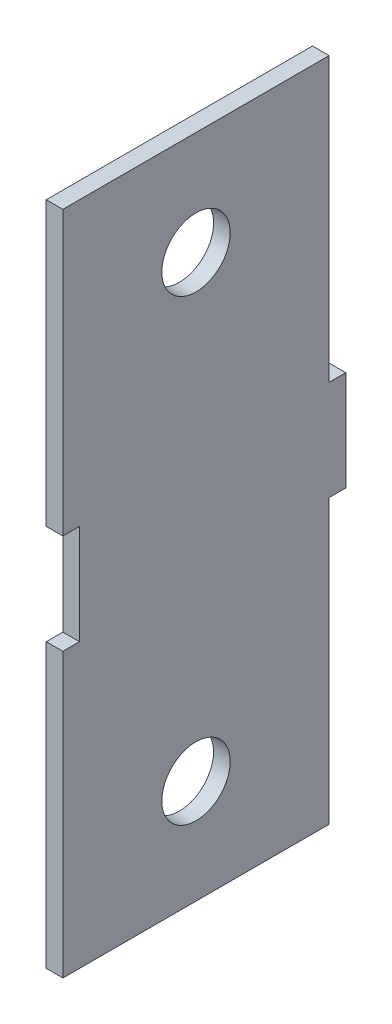
ISO-10303-21;
HEADER;
FILE_DESCRIPTION(('STEP AP214'),'2;1');
FILE_NAME('part.step','',(''),(''),'','','');
FILE_SCHEMA(('AUTOMOTIVE_DESIGN { 1 0 10303 214 1 1 1 1 }'));
ENDSEC;
DATA;
#1=APPLICATION_CONTEXT('core data for automotive mechanical design processes');
#2=APPLICATION_PROTOCOL_DEFINITION('international standard','automotive_design',2000,#1);
#3=PRODUCT_CONTEXT('',#1,'mechanical');
#4=PRODUCT('Part','Part','',(#3));
#5=PRODUCT_RELATED_PRODUCT_CATEGORY('part','',(#4));
#6=PRODUCT_DEFINITION_FORMATION('','',#4);
#7=PRODUCT_DEFINITION_CONTEXT('part definition',#1,'design');
#8=PRODUCT_DEFINITION('design','',#6,#7);
#9=PRODUCT_DEFINITION_SHAPE('','',#8);
#10=(LENGTH_UNIT() NAMED_UNIT(*) SI_UNIT(.MILLI.,.METRE.));
#11=(NAMED_UNIT(*) PLANE_ANGLE_UNIT() SI_UNIT($,.RADIAN.));
#12=(NAMED_UNIT(*) SI_UNIT($,.STERADIAN.) SOLID_ANGLE_UNIT());
#13=UNCERTAINTY_MEASURE_WITH_UNIT(LENGTH_MEASURE(1.E-05),#10,'distance_accuracy_value','');
#14=(GEOMETRIC_REPRESENTATION_CONTEXT(3) GLOBAL_UNCERTAINTY_ASSIGNED_CONTEXT((#13)) GLOBAL_UNIT_ASSIGNED_CONTEXT((#10,
#11,#12)) REPRESENTATION_CONTEXT('',''));
#15=CARTESIAN_POINT('',(0.,0.,0.));
#16=DIRECTION('',(0.,0.,1.));
#17=DIRECTION('',(1.,0.,0.));
#18=AXIS2_PLACEMENT_3D('',#15,#16,#17);
#19=CARTESIAN_POINT('',(1.5875,0.,0.));
#20=DIRECTION('',(-1.,0.,0.));
#21=DIRECTION('',(0.,0.,1.));
#22=AXIS2_PLACEMENT_3D('',#19,#20,#21);
#23=PLANE('',#22);
#24=CARTESIAN_POINT('',(1.5875,-21.844,0.));
#25=DIRECTION('',(1.,0.,0.));
#26=DIRECTION('',(0.,0.,-1.));
#27=AXIS2_PLACEMENT_3D('',#24,#25,#26);
#28=CIRCLE('',#27,3.2639);
#29=CARTESIAN_POINT('',(1.5875,-21.844,-3.26389999999992));
#30=VERTEX_POINT('',#29);
#31=EDGE_CURVE('E203',#30,#30,#28,.T.);
#32=ORIENTED_EDGE('',*,*,#31,.F.);
#33=EDGE_LOOP('',(#32));
#34=FACE_BOUND('',#33,.T.);
#35=CARTESIAN_POINT('',(1.5875,21.844,0.));
#36=DIRECTION('',(1.,0.,0.));
#37=DIRECTION('',(0.,0.,-1.));
#38=AXIS2_PLACEMENT_3D('',#35,#36,#37);
#39=CIRCLE('',#38,3.2639);
#40=CARTESIAN_POINT('',(1.5875,21.844,-3.26390000000007));
#41=VERTEX_POINT('',#40);
#42=EDGE_CURVE('E211',#41,#41,#39,.T.);
#43=ORIENTED_EDGE('',*,*,#42,.F.);
#44=EDGE_LOOP('',(#43));
#45=FACE_BOUND('',#44,.T.);
#46=DIRECTION('',(0.,0.,-1.));
#47=VECTOR('',#46,1.);
#48=CARTESIAN_POINT('',(1.5875,4.7625,12.7));
#49=LINE('',#48,#47);
#50=CARTESIAN_POINT('',(1.5875,4.7625,12.7));
#51=VERTEX_POINT('',#50);
#52=CARTESIAN_POINT('',(1.5875,4.7625,11.1125));
#53=VERTEX_POINT('',#52);
#54=EDGE_CURVE('E139',#51,#53,#49,.T.);
#55=ORIENTED_EDGE('',*,*,#54,.T.);
#56=DIRECTION('',(0.,-1.,0.));
#57=VECTOR('',#56,1.);
#58=CARTESIAN_POINT('',(1.5875,4.7625,11.1125));
#59=LINE('',#58,#57);
#60=CARTESIAN_POINT('',(1.5875,-4.7625,11.1125));
#61=VERTEX_POINT('',#60);
#62=EDGE_CURVE('E148',#53,#61,#59,.T.);
#63=ORIENTED_EDGE('',*,*,#62,.T.);
#64=DIRECTION('',(0.,0.,-1.));
#65=VECTOR('',#64,1.);
#66=CARTESIAN_POINT('',(1.5875,-4.7625,12.7));
#67=LINE('',#66,#65);
#68=CARTESIAN_POINT('',(1.5875,-4.7625,12.7));
#69=VERTEX_POINT('',#68);
#70=EDGE_CURVE('E154',#69,#61,#67,.T.);
#71=ORIENTED_EDGE('',*,*,#70,.F.);
#72=DIRECTION('',(0.,-1.,0.));
#73=VECTOR('',#72,1.);
#74=CARTESIAN_POINT('',(1.5875,-31.75,12.7));
#75=LINE('',#74,#73);
#76=CARTESIAN_POINT('',(1.5875,-31.75,12.7));
#77=VERTEX_POINT('',#76);
#78=EDGE_CURVE('E227',#69,#77,#75,.T.);
#79=ORIENTED_EDGE('',*,*,#78,.T.);
#80=DIRECTION('',(0.,0.,-1.));
#81=VECTOR('',#80,1.);
#82=CARTESIAN_POINT('',(1.5875,-31.75,12.7));
#83=LINE('',#82,#81);
#84=CARTESIAN_POINT('',(1.5875,-31.75,-12.7));
#85=VERTEX_POINT('',#84);
#86=EDGE_CURVE('E230',#77,#85,#83,.T.);
#87=ORIENTED_EDGE('',*,*,#86,.T.);
#88=DIRECTION('',(0.,1.,0.));
#89=VECTOR('',#88,1.);
#90=CARTESIAN_POINT('',(1.5875,-31.75,-12.7));
#91=LINE('',#90,#89);
#92=CARTESIAN_POINT('',(1.5875,-4.7625,-12.7));
#93=VERTEX_POINT('',#92);
#94=EDGE_CURVE('E219',#85,#93,#91,.T.);
#95=ORIENTED_EDGE('',*,*,#94,.T.);
#96=DIRECTION('',(0.,0.,-1.));
#97=VECTOR('',#96,1.);
#98=CARTESIAN_POINT('',(1.5875,-4.7625,-12.7));
#99=LINE('',#98,#97);
#100=CARTESIAN_POINT('',(1.5875,-4.7625,-14.2875));
#101=VERTEX_POINT('',#100);
#102=EDGE_CURVE('E69',#93,#101,#99,.T.);
#103=ORIENTED_EDGE('',*,*,#102,.T.);
#104=DIRECTION('',(0.,-1.,0.));
#105=VECTOR('',#104,1.);
#106=CARTESIAN_POINT('',(1.5875,4.7625,-14.2875));
#107=LINE('',#106,#105);
#108=CARTESIAN_POINT('',(1.5875,4.7625,-14.2875));
#109=VERTEX_POINT('',#108);
#110=EDGE_CURVE('E184',#109,#101,#107,.T.);
#111=ORIENTED_EDGE('',*,*,#110,.F.);
#112=DIRECTION('',(0.,0.,-1.));
#113=VECTOR('',#112,1.);
#114=CARTESIAN_POINT('',(1.5875,4.7625,-12.7));
#115=LINE('',#114,#113);
#116=CARTESIAN_POINT('',(1.5875,4.7625,-12.7));
#117=VERTEX_POINT('',#116);
#118=EDGE_CURVE('E175',#117,#109,#115,.T.);
#119=ORIENTED_EDGE('',*,*,#118,.F.);
#120=CARTESIAN_POINT('',(1.5875,31.75,-12.7));
#121=VERTEX_POINT('',#120);
#122=EDGE_CURVE('E224',#117,#121,#91,.T.);
#123=ORIENTED_EDGE('',*,*,#122,.T.);
#124=DIRECTION('',(0.,0.,1.));
#125=VECTOR('',#124,1.);
#126=CARTESIAN_POINT('',(1.5875,31.75,12.7));
#127=LINE('',#126,#125);
#128=CARTESIAN_POINT('',(1.5875,31.75,12.7));
#129=VERTEX_POINT('',#128);
#130=EDGE_CURVE('E223',#121,#129,#127,.T.);
#131=ORIENTED_EDGE('',*,*,#130,.T.);
#132=EDGE_CURVE('E158',#129,#51,#75,.T.);
#133=ORIENTED_EDGE('',*,*,#132,.T.);
#134=EDGE_LOOP('',(#55,#63,#71,#79,#87,#95,#103,#111,#119,#123,#131,#133));
#135=FACE_BOUND('',#134,.T.);
#136=ADVANCED_FACE('F45',(#34,#45,#135),#23,.F.);
#137=CARTESIAN_POINT('',(0.,0.,0.));
#138=DIRECTION('',(-1.,0.,0.));
#139=DIRECTION('',(0.,0.,1.));
#140=AXIS2_PLACEMENT_3D('',#137,#138,#139);
#141=PLANE('',#140);
#142=CARTESIAN_POINT('',(0.,21.844,0.));
#143=DIRECTION('',(1.,0.,0.));
#144=DIRECTION('',(0.,0.,-1.));
#145=AXIS2_PLACEMENT_3D('',#142,#143,#144);
#146=CIRCLE('',#145,3.2639);
#147=CARTESIAN_POINT('',(0.,21.844,-3.26390000000007));
#148=VERTEX_POINT('',#147);
#149=EDGE_CURVE('E207',#148,#148,#146,.T.);
#150=ORIENTED_EDGE('',*,*,#149,.T.);
#151=EDGE_LOOP('',(#150));
#152=FACE_BOUND('',#151,.T.);
#153=CARTESIAN_POINT('',(0.,-21.844,0.));
#154=DIRECTION('',(1.,0.,0.));
#155=DIRECTION('',(0.,0.,-1.));
#156=AXIS2_PLACEMENT_3D('',#153,#154,#155);
#157=CIRCLE('',#156,3.2639);
#158=CARTESIAN_POINT('',(0.,-21.844,-3.26389999999992));
#159=VERTEX_POINT('',#158);
#160=EDGE_CURVE('E193',#159,#159,#157,.T.);
#161=ORIENTED_EDGE('',*,*,#160,.T.);
#162=EDGE_LOOP('',(#161));
#163=FACE_BOUND('',#162,.T.);
#164=DIRECTION('',(0.,1.,0.));
#165=VECTOR('',#164,1.);
#166=CARTESIAN_POINT('',(0.,0.,11.1125));
#167=LINE('',#166,#165);
#168=CARTESIAN_POINT('',(0.,-4.7625,11.1125));
#169=VERTEX_POINT('',#168);
#170=CARTESIAN_POINT('',(0.,4.7625,11.1125));
#171=VERTEX_POINT('',#170);
#172=EDGE_CURVE('E11',#169,#171,#167,.T.);
#173=ORIENTED_EDGE('',*,*,#172,.T.);
#174=DIRECTION('',(0.,0.,1.));
#175=VECTOR('',#174,1.);
#176=CARTESIAN_POINT('',(0.,4.7625,0.));
#177=LINE('',#176,#175);
#178=CARTESIAN_POINT('',(0.,4.7625,12.7));
#179=VERTEX_POINT('',#178);
#180=EDGE_CURVE('E142',#171,#179,#177,.T.);
#181=ORIENTED_EDGE('',*,*,#180,.T.);
#182=DIRECTION('',(0.,-1.,0.));
#183=VECTOR('',#182,1.);
#184=CARTESIAN_POINT('',(0.,-31.75,12.7));
#185=LINE('',#184,#183);
#186=CARTESIAN_POINT('',(0.,31.75,12.7));
#187=VERTEX_POINT('',#186);
#188=EDGE_CURVE('E242',#187,#179,#185,.T.);
#189=ORIENTED_EDGE('',*,*,#188,.F.);
#190=DIRECTION('',(0.,0.,1.));
#191=VECTOR('',#190,1.);
#192=CARTESIAN_POINT('',(0.,31.75,12.7));
#193=LINE('',#192,#191);
#194=CARTESIAN_POINT('',(0.,31.75,-12.7));
#195=VERTEX_POINT('',#194);
#196=EDGE_CURVE('E238',#195,#187,#193,.T.);
#197=ORIENTED_EDGE('',*,*,#196,.F.);
#198=DIRECTION('',(0.,1.,0.));
#199=VECTOR('',#198,1.);
#200=CARTESIAN_POINT('',(0.,-31.75,-12.7));
#201=LINE('',#200,#199);
#202=CARTESIAN_POINT('',(0.,4.7625,-12.7));
#203=VERTEX_POINT('',#202);
#204=EDGE_CURVE('E215',#203,#195,#201,.T.);
#205=ORIENTED_EDGE('',*,*,#204,.F.);
#206=DIRECTION('',(0.,0.,-1.));
#207=VECTOR('',#206,1.);
#208=CARTESIAN_POINT('',(0.,4.7625,-12.7));
#209=LINE('',#208,#207);
#210=CARTESIAN_POINT('',(0.,4.7625,-14.2875));
#211=VERTEX_POINT('',#210);
#212=EDGE_CURVE('E178',#203,#211,#209,.T.);
#213=ORIENTED_EDGE('',*,*,#212,.T.);
#214=DIRECTION('',(0.,-1.,0.));
#215=VECTOR('',#214,1.);
#216=CARTESIAN_POINT('',(0.,4.7625,-14.2875));
#217=LINE('',#216,#215);
#218=CARTESIAN_POINT('',(0.,-4.7625,-14.2875));
#219=VERTEX_POINT('',#218);
#220=EDGE_CURVE('E174',#211,#219,#217,.T.);
#221=ORIENTED_EDGE('',*,*,#220,.T.);
#222=DIRECTION('',(0.,0.,-1.));
#223=VECTOR('',#222,1.);
#224=CARTESIAN_POINT('',(0.,-4.7625,-12.7));
#225=LINE('',#224,#223);
#226=CARTESIAN_POINT('',(0.,-4.7625,-12.7));
#227=VERTEX_POINT('',#226);
#228=EDGE_CURVE('E170',#227,#219,#225,.T.);
#229=ORIENTED_EDGE('',*,*,#228,.F.);
#230=CARTESIAN_POINT('',(0.,-31.75,-12.7));
#231=VERTEX_POINT('',#230);
#232=EDGE_CURVE('E234',#231,#227,#201,.T.);
#233=ORIENTED_EDGE('',*,*,#232,.F.);
#234=DIRECTION('',(0.,0.,-1.));
#235=VECTOR('',#234,1.);
#236=CARTESIAN_POINT('',(0.,-31.75,12.7));
#237=LINE('',#236,#235);
#238=CARTESIAN_POINT('',(0.,-31.75,12.7));
#239=VERTEX_POINT('',#238);
#240=EDGE_CURVE('E246',#239,#231,#237,.T.);
#241=ORIENTED_EDGE('',*,*,#240,.F.);
#242=CARTESIAN_POINT('',(0.,-4.7625,12.7));
#243=VERTEX_POINT('',#242);
#244=EDGE_CURVE('E241',#243,#239,#185,.T.);
#245=ORIENTED_EDGE('',*,*,#244,.F.);
#246=DIRECTION('',(0.,0.,1.));
#247=VECTOR('',#246,1.);
#248=CARTESIAN_POINT('',(0.,-4.76249999999999,0.));
#249=LINE('',#248,#247);
#250=EDGE_CURVE('E61',#169,#243,#249,.T.);
#251=ORIENTED_EDGE('',*,*,#250,.F.);
#252=EDGE_LOOP('',(#173,#181,#189,#197,#205,#213,#221,#229,#233,#241,#245,#251));
#253=FACE_BOUND('',#252,.T.);
#254=ADVANCED_FACE('F270',(#152,#163,#253),#141,.T.);
#255=CARTESIAN_POINT('',(1.5875,-31.75,12.7));
#256=DIRECTION('',(0.,0.,-1.));
#257=DIRECTION('',(-1.,0.,0.));
#258=AXIS2_PLACEMENT_3D('',#255,#256,#257);
#259=PLANE('',#258);
#260=DIRECTION('',(-1.,0.,0.));
#261=VECTOR('',#260,1.);
#262=CARTESIAN_POINT('',(1.5875,4.7625,12.7));
#263=LINE('',#262,#261);
#264=EDGE_CURVE('E54',#51,#179,#263,.T.);
#265=ORIENTED_EDGE('',*,*,#264,.F.);
#266=ORIENTED_EDGE('',*,*,#132,.F.);
#267=DIRECTION('',(-1.,0.,0.));
#268=VECTOR('',#267,1.);
#269=CARTESIAN_POINT('',(1.5875,31.75,12.7));
#270=LINE('',#269,#268);
#271=EDGE_CURVE('E256',#129,#187,#270,.T.);
#272=ORIENTED_EDGE('',*,*,#271,.T.);
#273=ORIENTED_EDGE('',*,*,#188,.T.);
#274=EDGE_LOOP('',(#265,#266,#272,#273));
#275=FACE_BOUND('',#274,.T.);
#276=ADVANCED_FACE('F272',(#275),#259,.F.);
#277=CARTESIAN_POINT('',(1.5875,-31.75,-12.7));
#278=DIRECTION('',(0.,0.,1.));
#279=DIRECTION('',(1.,0.,0.));
#280=AXIS2_PLACEMENT_3D('',#277,#278,#279);
#281=PLANE('',#280);
#282=DIRECTION('',(1.,0.,0.));
#283=VECTOR('',#282,1.);
#284=CARTESIAN_POINT('',(0.,4.7625,-12.7));
#285=LINE('',#284,#283);
#286=EDGE_CURVE('E194',#203,#117,#285,.T.);
#287=ORIENTED_EDGE('',*,*,#286,.F.);
#288=ORIENTED_EDGE('',*,*,#204,.T.);
#289=DIRECTION('',(-1.,0.,0.));
#290=VECTOR('',#289,1.);
#291=CARTESIAN_POINT('',(1.5875,31.75,-12.7));
#292=LINE('',#291,#290);
#293=EDGE_CURVE('E260',#121,#195,#292,.T.);
#294=ORIENTED_EDGE('',*,*,#293,.F.);
#295=ORIENTED_EDGE('',*,*,#122,.F.);
#296=EDGE_LOOP('',(#287,#288,#294,#295));
#297=FACE_BOUND('',#296,.T.);
#298=ADVANCED_FACE('F308',(#297),#281,.F.);
#299=ORIENTED_EDGE('',*,*,#232,.T.);
#300=DIRECTION('',(1.,0.,0.));
#301=VECTOR('',#300,1.);
#302=CARTESIAN_POINT('',(0.,-4.7625,-12.7));
#303=LINE('',#302,#301);
#304=EDGE_CURVE('E190',#227,#93,#303,.T.);
#305=ORIENTED_EDGE('',*,*,#304,.T.);
#306=ORIENTED_EDGE('',*,*,#94,.F.);
#307=DIRECTION('',(-1.,0.,0.));
#308=VECTOR('',#307,1.);
#309=CARTESIAN_POINT('',(1.5875,-31.75,-12.7));
#310=LINE('',#309,#308);
#311=EDGE_CURVE('E233',#85,#231,#310,.T.);
#312=ORIENTED_EDGE('',*,*,#311,.T.);
#313=EDGE_LOOP('',(#299,#305,#306,#312));
#314=FACE_BOUND('',#313,.T.);
#315=ADVANCED_FACE('F47',(#314),#281,.F.);
#316=CARTESIAN_POINT('',(1.5875,31.75,12.7));
#317=DIRECTION('',(0.,-1.,0.));
#318=DIRECTION('',(0.,0.,-1.));
#319=AXIS2_PLACEMENT_3D('',#316,#317,#318);
#320=PLANE('',#319);
#321=ORIENTED_EDGE('',*,*,#196,.T.);
#322=ORIENTED_EDGE('',*,*,#271,.F.);
#323=ORIENTED_EDGE('',*,*,#130,.F.);
#324=ORIENTED_EDGE('',*,*,#293,.T.);
#325=EDGE_LOOP('',(#321,#322,#323,#324));
#326=FACE_BOUND('',#325,.T.);
#327=ADVANCED_FACE('F276',(#326),#320,.F.);
#328=ORIENTED_EDGE('',*,*,#78,.F.);
#329=DIRECTION('',(-1.,0.,0.));
#330=VECTOR('',#329,1.);
#331=CARTESIAN_POINT('',(1.5875,-4.7625,12.7));
#332=LINE('',#331,#330);
#333=EDGE_CURVE('E264',#69,#243,#332,.T.);
#334=ORIENTED_EDGE('',*,*,#333,.T.);
#335=ORIENTED_EDGE('',*,*,#244,.T.);
#336=DIRECTION('',(-1.,0.,0.));
#337=VECTOR('',#336,1.);
#338=CARTESIAN_POINT('',(1.5875,-31.75,12.7));
#339=LINE('',#338,#337);
#340=EDGE_CURVE('E252',#77,#239,#339,.T.);
#341=ORIENTED_EDGE('',*,*,#340,.F.);
#342=EDGE_LOOP('',(#328,#334,#335,#341));
#343=FACE_BOUND('',#342,.T.);
#344=ADVANCED_FACE('F291',(#343),#259,.F.);
#345=CARTESIAN_POINT('',(1.5875,-31.75,12.7));
#346=DIRECTION('',(0.,1.,0.));
#347=DIRECTION('',(0.,0.,1.));
#348=AXIS2_PLACEMENT_3D('',#345,#346,#347);
#349=PLANE('',#348);
#350=ORIENTED_EDGE('',*,*,#240,.T.);
#351=ORIENTED_EDGE('',*,*,#311,.F.);
#352=ORIENTED_EDGE('',*,*,#86,.F.);
#353=ORIENTED_EDGE('',*,*,#340,.T.);
#354=EDGE_LOOP('',(#350,#351,#352,#353));
#355=FACE_BOUND('',#354,.T.);
#356=ADVANCED_FACE('F295',(#355),#349,.F.);
#357=CARTESIAN_POINT('',(1.5875,21.844,0.));
#358=DIRECTION('',(-1.,0.,0.));
#359=DIRECTION('',(0.,0.,1.));
#360=AXIS2_PLACEMENT_3D('',#357,#358,#359);
#361=CYLINDRICAL_SURFACE('',#360,3.2639);
#362=ORIENTED_EDGE('',*,*,#42,.T.);
#363=EDGE_LOOP('',(#362));
#364=FACE_BOUND('',#363,.T.);
#365=ORIENTED_EDGE('',*,*,#149,.F.);
#366=EDGE_LOOP('',(#365));
#367=FACE_BOUND('',#366,.T.);
#368=ADVANCED_FACE('F328',(#364,#367),#361,.F.);
#369=CARTESIAN_POINT('',(1.5875,-21.844,0.));
#370=DIRECTION('',(-1.,0.,0.));
#371=DIRECTION('',(0.,0.,1.));
#372=AXIS2_PLACEMENT_3D('',#369,#370,#371);
#373=CYLINDRICAL_SURFACE('',#372,3.2639);
#374=ORIENTED_EDGE('',*,*,#31,.T.);
#375=EDGE_LOOP('',(#374));
#376=FACE_BOUND('',#375,.T.);
#377=ORIENTED_EDGE('',*,*,#160,.F.);
#378=EDGE_LOOP('',(#377));
#379=FACE_BOUND('',#378,.T.);
#380=ADVANCED_FACE('F349',(#376,#379),#373,.F.);
#381=CARTESIAN_POINT('',(0.,-4.7625,-12.7));
#382=DIRECTION('',(0.,-1.,0.));
#383=DIRECTION('',(0.,0.,-1.));
#384=AXIS2_PLACEMENT_3D('',#381,#382,#383);
#385=PLANE('',#384);
#386=ORIENTED_EDGE('',*,*,#102,.F.);
#387=ORIENTED_EDGE('',*,*,#304,.F.);
#388=ORIENTED_EDGE('',*,*,#228,.T.);
#389=DIRECTION('',(1.,0.,0.));
#390=VECTOR('',#389,1.);
#391=CARTESIAN_POINT('',(0.,-4.7625,-14.2875));
#392=LINE('',#391,#390);
#393=EDGE_CURVE('E181',#219,#101,#392,.T.);
#394=ORIENTED_EDGE('',*,*,#393,.T.);
#395=EDGE_LOOP('',(#386,#387,#388,#394));
#396=FACE_BOUND('',#395,.T.);
#397=ADVANCED_FACE('F356',(#396),#385,.T.);
#398=CARTESIAN_POINT('',(0.,4.7625,-12.7));
#399=DIRECTION('',(0.,-1.,0.));
#400=DIRECTION('',(0.,0.,-1.));
#401=AXIS2_PLACEMENT_3D('',#398,#399,#400);
#402=PLANE('',#401);
#403=ORIENTED_EDGE('',*,*,#118,.T.);
#404=DIRECTION('',(1.,0.,0.));
#405=VECTOR('',#404,1.);
#406=CARTESIAN_POINT('',(0.,4.7625,-14.2875));
#407=LINE('',#406,#405);
#408=EDGE_CURVE('E197',#211,#109,#407,.T.);
#409=ORIENTED_EDGE('',*,*,#408,.F.);
#410=ORIENTED_EDGE('',*,*,#212,.F.);
#411=ORIENTED_EDGE('',*,*,#286,.T.);
#412=EDGE_LOOP('',(#403,#409,#410,#411));
#413=FACE_BOUND('',#412,.T.);
#414=ADVANCED_FACE('F307',(#413),#402,.F.);
#415=CARTESIAN_POINT('',(0.,4.7625,-14.2875));
#416=DIRECTION('',(0.,0.,1.));
#417=DIRECTION('',(1.,0.,0.));
#418=AXIS2_PLACEMENT_3D('',#415,#416,#417);
#419=PLANE('',#418);
#420=ORIENTED_EDGE('',*,*,#110,.T.);
#421=ORIENTED_EDGE('',*,*,#393,.F.);
#422=ORIENTED_EDGE('',*,*,#220,.F.);
#423=ORIENTED_EDGE('',*,*,#408,.T.);
#424=EDGE_LOOP('',(#420,#421,#422,#423));
#425=FACE_BOUND('',#424,.T.);
#426=ADVANCED_FACE('F304',(#425),#419,.F.);
#427=CARTESIAN_POINT('',(-1.5875,4.7625,12.7));
#428=DIRECTION('',(0.,-1.,0.));
#429=DIRECTION('',(0.,0.,-1.));
#430=AXIS2_PLACEMENT_3D('',#427,#428,#429);
#431=PLANE('',#430);
#432=DIRECTION('',(1.,0.,0.));
#433=VECTOR('',#432,1.);
#434=CARTESIAN_POINT('',(-1.5875,4.7625,11.1125));
#435=LINE('',#434,#433);
#436=EDGE_CURVE('E135',#171,#53,#435,.T.);
#437=ORIENTED_EDGE('',*,*,#436,.T.);
#438=ORIENTED_EDGE('',*,*,#54,.F.);
#439=ORIENTED_EDGE('',*,*,#264,.T.);
#440=ORIENTED_EDGE('',*,*,#180,.F.);
#441=EDGE_LOOP('',(#437,#438,#439,#440));
#442=FACE_BOUND('',#441,.T.);
#443=ADVANCED_FACE('F137',(#442),#431,.T.);
#444=CARTESIAN_POINT('',(-1.5875,4.7625,11.1125));
#445=DIRECTION('',(0.,0.,1.));
#446=DIRECTION('',(1.,0.,0.));
#447=AXIS2_PLACEMENT_3D('',#444,#445,#446);
#448=PLANE('',#447);
#449=DIRECTION('',(1.,0.,0.));
#450=VECTOR('',#449,1.);
#451=CARTESIAN_POINT('',(-1.5875,-4.7625,11.1125));
#452=LINE('',#451,#450);
#453=EDGE_CURVE('E145',#169,#61,#452,.T.);
#454=ORIENTED_EDGE('',*,*,#453,.T.);
#455=ORIENTED_EDGE('',*,*,#62,.F.);
#456=ORIENTED_EDGE('',*,*,#436,.F.);
#457=ORIENTED_EDGE('',*,*,#172,.F.);
#458=EDGE_LOOP('',(#454,#455,#456,#457));
#459=FACE_BOUND('',#458,.T.);
#460=ADVANCED_FACE('F149',(#459),#448,.T.);
#461=CARTESIAN_POINT('',(-1.5875,-4.7625,12.7));
#462=DIRECTION('',(0.,-1.,0.));
#463=DIRECTION('',(0.,0.,-1.));
#464=AXIS2_PLACEMENT_3D('',#461,#462,#463);
#465=PLANE('',#464);
#466=ORIENTED_EDGE('',*,*,#250,.T.);
#467=ORIENTED_EDGE('',*,*,#333,.F.);
#468=ORIENTED_EDGE('',*,*,#70,.T.);
#469=ORIENTED_EDGE('',*,*,#453,.F.);
#470=EDGE_LOOP('',(#466,#467,#468,#469));
#471=FACE_BOUND('',#470,.T.);
#472=ADVANCED_FACE('F424',(#471),#465,.F.);
#473=CLOSED_SHELL('',(#136,#254,#276,#298,#315,#327,#344,#356,#368,#380,#397,#414,#426,#443,
#460,#472));
#474=MANIFOLD_SOLID_BREP('B2',#473);
#475=ADVANCED_BREP_SHAPE_REPRESENTATION('',(#18,#474),#14);
#476=SHAPE_DEFINITION_REPRESENTATION(#9,#475);
ENDSEC;
END-ISO-10303-21;
